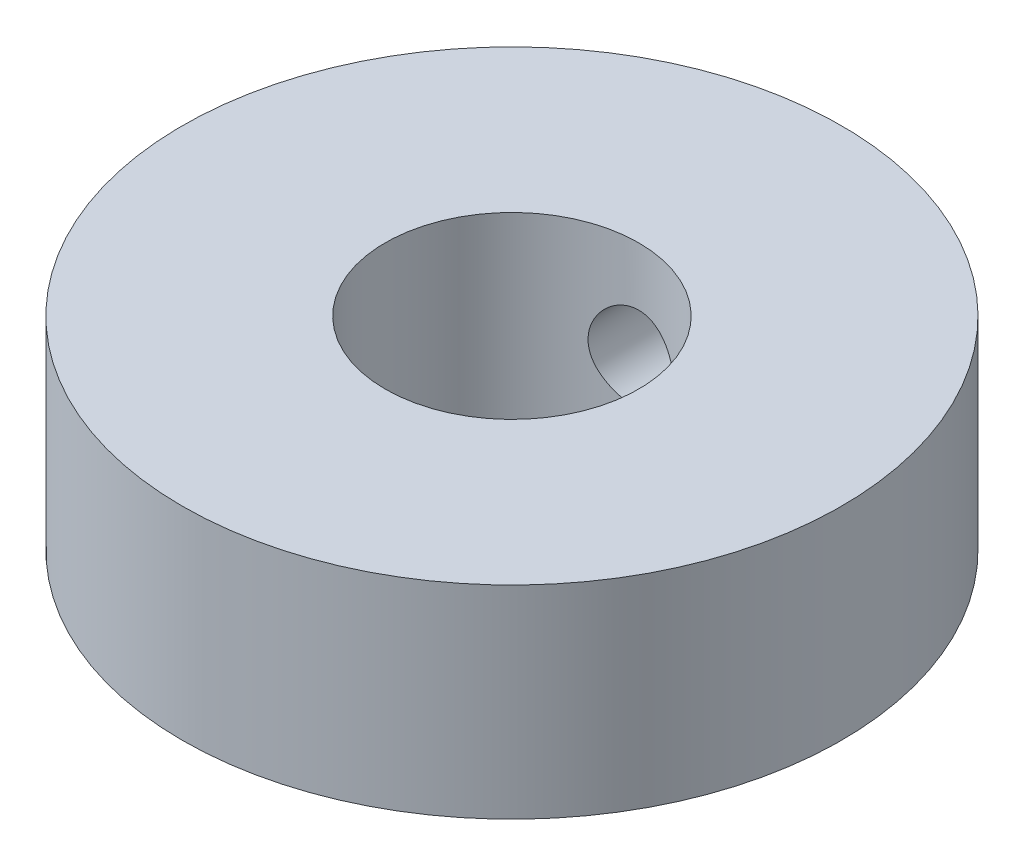
ISO-10303-21;
HEADER;
FILE_DESCRIPTION(('STEP AP214'),'2;1');
FILE_NAME('part.step','',(''),(''),'','','');
FILE_SCHEMA(('AUTOMOTIVE_DESIGN { 1 0 10303 214 1 1 1 1 }'));
ENDSEC;
DATA;
#1=APPLICATION_CONTEXT('core data for automotive mechanical design processes');
#2=APPLICATION_PROTOCOL_DEFINITION('international standard','automotive_design',2000,#1);
#3=PRODUCT_CONTEXT('',#1,'mechanical');
#4=PRODUCT('Part','Part','',(#3));
#5=PRODUCT_RELATED_PRODUCT_CATEGORY('part','',(#4));
#6=PRODUCT_DEFINITION_FORMATION('','',#4);
#7=PRODUCT_DEFINITION_CONTEXT('part definition',#1,'design');
#8=PRODUCT_DEFINITION('design','',#6,#7);
#9=PRODUCT_DEFINITION_SHAPE('','',#8);
#10=(LENGTH_UNIT() NAMED_UNIT(*) SI_UNIT(.MILLI.,.METRE.));
#11=(NAMED_UNIT(*) PLANE_ANGLE_UNIT() SI_UNIT($,.RADIAN.));
#12=(NAMED_UNIT(*) SI_UNIT($,.STERADIAN.) SOLID_ANGLE_UNIT());
#13=UNCERTAINTY_MEASURE_WITH_UNIT(LENGTH_MEASURE(1.E-05),#10,'distance_accuracy_value','');
#14=(GEOMETRIC_REPRESENTATION_CONTEXT(3) GLOBAL_UNCERTAINTY_ASSIGNED_CONTEXT((#13)) GLOBAL_UNIT_ASSIGNED_CONTEXT((#10,
#11,#12)) REPRESENTATION_CONTEXT('',''));
#15=CARTESIAN_POINT('',(0.,0.,0.));
#16=DIRECTION('',(0.,0.,1.));
#17=DIRECTION('',(1.,0.,0.));
#18=AXIS2_PLACEMENT_3D('',#15,#16,#17);
#19=CARTESIAN_POINT('',(0.,4.,0.));
#20=DIRECTION('',(0.,-1.,0.));
#21=DIRECTION('',(0.,0.,-1.));
#22=AXIS2_PLACEMENT_3D('',#19,#20,#21);
#23=CYLINDRICAL_SURFACE('',#22,6.5);
#24=CARTESIAN_POINT('',(0.,2.85,-6.5));
#25=CARTESIAN_POINT('',(-0.0475273119300373,2.84999799248828,-6.49999931236995));
#26=CARTESIAN_POINT('',(-0.0950838685352852,2.84600035816591,-6.49947323178086));
#27=CARTESIAN_POINT('',(-0.188872368165704,2.83011684021345,-6.49742520084858));
#28=CARTESIAN_POINT('',(-0.235102897000391,2.81822283933022,-6.49590222574721));
#29=CARTESIAN_POINT('',(-0.324868083813184,2.7869041035556,-6.49203188637918));
#30=CARTESIAN_POINT('',(-0.368404580616325,2.76748457249615,-6.48968509188108));
#31=CARTESIAN_POINT('',(-0.451592799552969,2.7216777075832,-6.48442776009261));
#32=CARTESIAN_POINT('',(-0.491245159131509,2.69529151969785,-6.48151731553985));
#33=CARTESIAN_POINT('',(-0.565785461247439,2.63613115202925,-6.47543781799477));
#34=CARTESIAN_POINT('',(-0.600646721904666,2.60332348431148,-6.47226746224012));
#35=CARTESIAN_POINT('',(-0.664385356510938,2.53232339768736,-6.46603589805202));
#36=CARTESIAN_POINT('',(-0.693262417465414,2.49413069730044,-6.46297469533459));
#37=CARTESIAN_POINT('',(-0.74431334689203,2.41326995922278,-6.4572952689164));
#38=CARTESIAN_POINT('',(-0.766462032006156,2.37058589399584,-6.45467872521815));
#39=CARTESIAN_POINT('',(-0.803266641578355,2.28206400552667,-6.45020220775352));
#40=CARTESIAN_POINT('',(-0.817922876539048,2.23622631306661,-6.44834220263528));
#41=CARTESIAN_POINT('',(-0.839245060342877,2.14297614512216,-6.44560189600989));
#42=CARTESIAN_POINT('',(-0.845956211853722,2.09557417116493,-6.44471605417937));
#43=CARTESIAN_POINT('',(-0.851337631414068,2.0003091413657,-6.44400745184395));
#44=CARTESIAN_POINT('',(-0.850008252370653,1.95244610585223,-6.44418464468138));
#45=CARTESIAN_POINT('',(-0.839383416745476,1.85793354974842,-6.44557702109154));
#46=CARTESIAN_POINT('',(-0.830137870368509,1.811278308926,-6.44678570114109));
#47=CARTESIAN_POINT('',(-0.804021074584761,1.72018722848242,-6.45009471801948));
#48=CARTESIAN_POINT('',(-0.787149657380237,1.67575143772138,-6.45219507446846));
#49=CARTESIAN_POINT('',(-0.746206767010475,1.59020626326385,-6.45705812107574));
#50=CARTESIAN_POINT('',(-0.72211372333688,1.54910732056856,-6.4598227905148));
#51=CARTESIAN_POINT('',(-0.667426908644924,1.47151694351829,-6.46570144773469));
#52=CARTESIAN_POINT('',(-0.636832812381057,1.43502573983264,-6.46881545298899));
#53=CARTESIAN_POINT('',(-0.569736309200595,1.36739708857793,-6.47507078642568));
#54=CARTESIAN_POINT('',(-0.533190905197018,1.33630228649931,-6.4782121429061));
#55=CARTESIAN_POINT('',(-0.455376896527025,1.28068155257026,-6.48414619584979));
#56=CARTESIAN_POINT('',(-0.414108279143427,1.25615563840706,-6.48693889137425));
#57=CARTESIAN_POINT('',(-0.327985545021085,1.21436838716425,-6.49186293139433));
#58=CARTESIAN_POINT('',(-0.283130052588049,1.1971098534394,-6.49399402059558));
#59=CARTESIAN_POINT('',(-0.191123614887421,1.1703818130707,-6.49735246309834));
#60=CARTESIAN_POINT('',(-0.143972787431609,1.16091190710848,-6.49857986273115));
#61=CARTESIAN_POINT('',(-0.0490827058108788,1.15008551807086,-6.49998658524286));
#62=CARTESIAN_POINT('',(-0.00135025940025587,1.14867031433475,-6.5001734933284));
#63=CARTESIAN_POINT('',(0.0936711479515367,1.15383834443808,-6.4994986892131));
#64=CARTESIAN_POINT('',(0.140960119225019,1.16042139146127,-6.49863700150447));
#65=CARTESIAN_POINT('',(0.233577960306399,1.18135026023174,-6.49596654168531));
#66=CARTESIAN_POINT('',(0.278913294107725,1.19566795181326,-6.49416120231276));
#67=CARTESIAN_POINT('',(0.366539538975663,1.2316303472019,-6.48980547358616));
#68=CARTESIAN_POINT('',(0.408830337795954,1.25327532098464,-6.48725505678));
#69=CARTESIAN_POINT('',(0.489428417687729,1.30341900138495,-6.48167440114856));
#70=CARTESIAN_POINT('',(0.527711980882102,1.3319555345954,-6.4786415468053));
#71=CARTESIAN_POINT('',(0.598967234536641,1.39501895679937,-6.47244311614296));
#72=CARTESIAN_POINT('',(0.631938693293378,1.42954610695535,-6.46927753404213));
#73=CARTESIAN_POINT('',(0.691843291628349,1.50386993358234,-6.46314688382088));
#74=CARTESIAN_POINT('',(0.718737409777831,1.5436981913656,-6.46018319234455));
#75=CARTESIAN_POINT('',(0.765453971337151,1.62734104705949,-6.45481490857007));
#76=CARTESIAN_POINT('',(0.78527656764822,1.67115555875319,-6.45241030418368));
#77=CARTESIAN_POINT('',(0.817224795407047,1.76140334255998,-6.44844196894699));
#78=CARTESIAN_POINT('',(0.829372110969365,1.80782882981979,-6.4468758710884));
#79=CARTESIAN_POINT('',(0.845694628529959,1.90208253157206,-6.44475519030191));
#80=CARTESIAN_POINT('',(0.84987023940484,1.94991067399319,-6.44420055549513));
#81=CARTESIAN_POINT('',(0.850122835656126,2.04522367056629,-6.44416720570299));
#82=CARTESIAN_POINT('',(0.846261133097074,2.0927083709792,-6.44468034527192));
#83=CARTESIAN_POINT('',(0.830678891126429,2.18634745705122,-6.44670717349693));
#84=CARTESIAN_POINT('',(0.818958353426524,2.23250184300008,-6.44822086193507));
#85=CARTESIAN_POINT('',(0.788010869452964,2.32216014144768,-6.45207564311973));
#86=CARTESIAN_POINT('',(0.768787167111572,2.36566518998194,-6.45441637825794));
#87=CARTESIAN_POINT('',(0.723385069356216,2.44884203326501,-6.45966206427547));
#88=CARTESIAN_POINT('',(0.697206554418634,2.48851376211941,-6.46256702485119));
#89=CARTESIAN_POINT('',(0.638411428341679,2.56321088075938,-6.46864036714318));
#90=CARTESIAN_POINT('',(0.605749169236973,2.59820019940238,-6.47181051866752));
#91=CARTESIAN_POINT('',(0.535009414588285,2.66222427410943,-6.4780415983337));
#92=CARTESIAN_POINT('',(0.496930648538757,2.69125762921894,-6.48110250063853));
#93=CARTESIAN_POINT('',(0.416255998760747,2.74264968738202,-6.48678438059768));
#94=CARTESIAN_POINT('',(0.373642000074418,2.76498014988817,-6.48940347710873));
#95=CARTESIAN_POINT('',(0.285257499923472,2.80213549893326,-6.49388776458797));
#96=CARTESIAN_POINT('',(0.239490454569184,2.81696845943889,-6.49575376611631));
#97=CARTESIAN_POINT('',(0.161244230967052,2.83519674337797,-6.49807688480155));
#98=CARTESIAN_POINT('',(0.129256406178424,2.84073987964473,-6.49879449916708));
#99=CARTESIAN_POINT('',(0.0648502577853982,2.84814217751771,-6.49975628940328));
#100=CARTESIAN_POINT('',(0.0324319377792675,2.85000136989644,-6.50000046922862));
#101=CARTESIAN_POINT('',(0.,2.85,-6.5));
#102=B_SPLINE_CURVE_WITH_KNOTS('',3,(#24,#25,#26,#27,#28,#29,#30,#31,#32,#33,#34,#35,#36,#37,
#38,#39,#40,#41,#42,#43,#44,#45,#46,#47,#48,#49,#50,#51,#52,#53,#54,#55,#56,#57,#58,#59,#60,#61,
#62,#63,#64,#65,#66,#67,#68,#69,#70,#71,#72,#73,#74,#75,#76,#77,#78,#79,#80,#81,#82,#83,#84,#85,
#86,#87,#88,#89,#90,#91,#92,#93,#94,#95,#96,#97,#98,#99,#100,#101),.UNSPECIFIED.,.T.,.F.,(4,2,2,
2,2,2,2,2,2,2,2,2,2,2,2,2,2,2,2,2,2,2,2,2,2,2,2,2,2,2,2,2,2,2,2,2,2,2,4),(0.,0.142463462525733,
0.285073600902839,0.427585301196982,0.57007357386517,0.713325732172383,0.856585381178341,
1.000374805454,1.14415827031556,1.28711970254374,1.43007486009443,1.57213528912614,
1.71419884417195,1.856691035145,1.99919035663422,2.14276903568952,2.28634810133738,
2.4299825012501,2.57360953665222,2.71618814287226,2.85876341892822,3.0008236193046,
3.14288905449594,3.28575273104674,3.42862263734086,3.57238534735202,3.71614494872143,
3.85949656443053,4.00284082729618,4.14509560786373,4.28735035744755,4.42954367235129,
4.57173943111083,4.71497427359935,4.85824276908101,5.00210667226394,5.14581531835642,
5.24303109934419,5.34024606827101),.UNSPECIFIED.);
#103=CARTESIAN_POINT('',(0.,2.85,-6.5));
#104=VERTEX_POINT('',#103);
#105=EDGE_CURVE('E58',#104,#104,#102,.T.);
#106=ORIENTED_EDGE('',*,*,#105,.T.);
#107=EDGE_LOOP('',(#106));
#108=FACE_BOUND('',#107,.T.);
#109=CARTESIAN_POINT('',(0.,4.,0.));
#110=DIRECTION('',(0.,1.,0.));
#111=DIRECTION('',(0.,0.,1.));
#112=AXIS2_PLACEMENT_3D('',#109,#110,#111);
#113=CIRCLE('',#112,6.5);
#114=CARTESIAN_POINT('',(0.,4.,6.5));
#115=VERTEX_POINT('',#114);
#116=EDGE_CURVE('E10',#115,#115,#113,.T.);
#117=ORIENTED_EDGE('',*,*,#116,.F.);
#118=EDGE_LOOP('',(#117));
#119=FACE_BOUND('',#118,.T.);
#120=CARTESIAN_POINT('',(0.,0.,0.));
#121=DIRECTION('',(0.,1.,0.));
#122=DIRECTION('',(0.,0.,1.));
#123=AXIS2_PLACEMENT_3D('',#120,#121,#122);
#124=CIRCLE('',#123,6.5);
#125=CARTESIAN_POINT('',(0.,0.,6.5));
#126=VERTEX_POINT('',#125);
#127=EDGE_CURVE('E48',#126,#126,#124,.T.);
#128=ORIENTED_EDGE('',*,*,#127,.T.);
#129=EDGE_LOOP('',(#128));
#130=FACE_BOUND('',#129,.T.);
#131=ADVANCED_FACE('F35',(#108,#119,#130),#23,.T.);
#132=CARTESIAN_POINT('',(0.,4.,0.));
#133=DIRECTION('',(0.,1.,0.));
#134=DIRECTION('',(0.,0.,1.));
#135=AXIS2_PLACEMENT_3D('',#132,#133,#134);
#136=PLANE('',#135);
#137=CARTESIAN_POINT('',(0.,4.,0.));
#138=DIRECTION('',(0.,1.,0.));
#139=DIRECTION('',(0.,0.,1.));
#140=AXIS2_PLACEMENT_3D('',#137,#138,#139);
#141=CIRCLE('',#140,2.5);
#142=CARTESIAN_POINT('',(0.,4.,2.5));
#143=VERTEX_POINT('',#142);
#144=EDGE_CURVE('E55',#143,#143,#141,.T.);
#145=ORIENTED_EDGE('',*,*,#144,.F.);
#146=EDGE_LOOP('',(#145));
#147=FACE_BOUND('',#146,.T.);
#148=ORIENTED_EDGE('',*,*,#116,.T.);
#149=EDGE_LOOP('',(#148));
#150=FACE_BOUND('',#149,.T.);
#151=ADVANCED_FACE('F76',(#147,#150),#136,.T.);
#152=CARTESIAN_POINT('',(0.,0.,0.));
#153=DIRECTION('',(0.,1.,0.));
#154=DIRECTION('',(0.,0.,1.));
#155=AXIS2_PLACEMENT_3D('',#152,#153,#154);
#156=PLANE('',#155);
#157=CARTESIAN_POINT('',(0.,0.,0.));
#158=DIRECTION('',(0.,1.,0.));
#159=DIRECTION('',(0.,0.,1.));
#160=AXIS2_PLACEMENT_3D('',#157,#158,#159);
#161=CIRCLE('',#160,2.5);
#162=CARTESIAN_POINT('',(0.,0.,2.5));
#163=VERTEX_POINT('',#162);
#164=EDGE_CURVE('E53',#163,#163,#161,.T.);
#165=ORIENTED_EDGE('',*,*,#164,.T.);
#166=EDGE_LOOP('',(#165));
#167=FACE_BOUND('',#166,.T.);
#168=ORIENTED_EDGE('',*,*,#127,.F.);
#169=EDGE_LOOP('',(#168));
#170=FACE_BOUND('',#169,.T.);
#171=ADVANCED_FACE('F74',(#167,#170),#156,.F.);
#172=CARTESIAN_POINT('',(0.,0.,0.));
#173=DIRECTION('',(0.,1.,0.));
#174=DIRECTION('',(0.,0.,1.));
#175=AXIS2_PLACEMENT_3D('',#172,#173,#174);
#176=CYLINDRICAL_SURFACE('',#175,2.5);
#177=CARTESIAN_POINT('',(0.85,2.,-2.35106358910175));
#178=CARTESIAN_POINT('',(0.850000417270898,1.95376164490342,-2.3510632609211));
#179=CARTESIAN_POINT('',(0.846214354628692,1.90752612226471,-2.35244254128552));
#180=CARTESIAN_POINT('',(0.831223875310693,1.81642861890939,-2.35778048931454));
#181=CARTESIAN_POINT('',(0.820018482005375,1.77156681983379,-2.3617394965555));
#182=CARTESIAN_POINT('',(0.790631455227936,1.68455195770899,-2.37173774436268));
#183=CARTESIAN_POINT('',(0.772463944485031,1.64239361146623,-2.37777277118094));
#184=CARTESIAN_POINT('',(0.729716931435302,1.56170902291919,-2.39123683414157));
#185=CARTESIAN_POINT('',(0.7051359268366,1.52318363447845,-2.3986661967775));
#186=CARTESIAN_POINT('',(0.649187335973049,1.44928956772992,-2.41442111465153));
#187=CARTESIAN_POINT('',(0.617602382715345,1.41409032601702,-2.4227696522799));
#188=CARTESIAN_POINT('',(0.549005955744845,1.34937217564943,-2.43922839215936));
#189=CARTESIAN_POINT('',(0.51199357221197,1.31985422129211,-2.4473385541765));
#190=CARTESIAN_POINT('',(0.432346716431164,1.26656061277013,-2.4626739166969));
#191=CARTESIAN_POINT('',(0.389586453681494,1.24296350328226,-2.46986895296675));
#192=CARTESIAN_POINT('',(0.300416628138625,1.20336479777731,-2.48229176229121));
#193=CARTESIAN_POINT('',(0.254008095502596,1.18736106654415,-2.48752008828811));
#194=CARTESIAN_POINT('',(0.160636361785038,1.1639809630024,-2.49525754722281));
#195=CARTESIAN_POINT('',(0.113753604818566,1.15631411308221,-2.49785799375087));
#196=CARTESIAN_POINT('',(0.0192997362665524,1.14890070609165,-2.5003713737019));
#197=CARTESIAN_POINT('',(-0.0282711874729492,1.14915202693685,-2.50028502719045));
#198=CARTESIAN_POINT('',(-0.120691048885994,1.15738587557199,-2.49749585373529));
#199=CARTESIAN_POINT('',(-0.165571873225012,1.16505267278795,-2.49489988196776));
#200=CARTESIAN_POINT('',(-0.253367127735348,1.18737635345875,-2.4875182170927));
#201=CARTESIAN_POINT('',(-0.296281423107985,1.20203371530909,-2.48273237412343));
#202=CARTESIAN_POINT('',(-0.379603280671135,1.23810082600777,-2.47137503550215));
#203=CARTESIAN_POINT('',(-0.419969516814054,1.25959847736236,-2.464780457795));
#204=CARTESIAN_POINT('',(-0.496613318407138,1.30866275214614,-2.45048921005046));
#205=CARTESIAN_POINT('',(-0.532889710810776,1.33623111010991,-2.44279222525125));
#206=CARTESIAN_POINT('',(-0.602199984798618,1.39823490603076,-2.42666096452814));
#207=CARTESIAN_POINT('',(-0.634988837975162,1.43294005356478,-2.41820903956142));
#208=CARTESIAN_POINT('',(-0.694362465349822,1.50742552246526,-2.40183505911393));
#209=CARTESIAN_POINT('',(-0.720946201284473,1.54720669145079,-2.39391309246575));
#210=CARTESIAN_POINT('',(-0.767512946148537,1.63151998575289,-2.37939703570253));
#211=CARTESIAN_POINT('',(-0.78738829677466,1.67611569984484,-2.37282521063779));
#212=CARTESIAN_POINT('',(-0.819262679307919,1.768301144217,-2.36201086330706));
#213=CARTESIAN_POINT('',(-0.831265172844013,1.81588954853627,-2.35776731745071));
#214=CARTESIAN_POINT('',(-0.846545419453233,1.91032801924697,-2.35232309828418));
#215=CARTESIAN_POINT('',(-0.850204583078747,1.95710871205399,-2.35098952835552));
#216=CARTESIAN_POINT('',(-0.849777826537737,2.05062480904703,-2.35114400939308));
#217=CARTESIAN_POINT('',(-0.845693387012103,2.09736022018174,-2.35263152094523));
#218=CARTESIAN_POINT('',(-0.830238624465381,2.1876917760919,-2.35812767196496));
#219=CARTESIAN_POINT('',(-0.819137710085228,2.23134030837741,-2.36204299077373));
#220=CARTESIAN_POINT('',(-0.790290757874596,2.31614485750604,-2.37184970007307));
#221=CARTESIAN_POINT('',(-0.772543512350059,2.35730041977571,-2.37774144967739));
#222=CARTESIAN_POINT('',(-0.730249496019326,2.43744187613449,-2.39107533826993));
#223=CARTESIAN_POINT('',(-0.705499493021902,2.47631293148089,-2.39856184703898));
#224=CARTESIAN_POINT('',(-0.650130609476585,2.54948774405826,-2.41415744920299));
#225=CARTESIAN_POINT('',(-0.619509932091421,2.58379009748513,-2.42226673275395));
#226=CARTESIAN_POINT('',(-0.551437950288512,2.64864095894312,-2.43868829519525));
#227=CARTESIAN_POINT('',(-0.513720241123424,2.67891328881005,-2.4469902188749));
#228=CARTESIAN_POINT('',(-0.433535678255624,2.73271917867289,-2.46246048598768));
#229=CARTESIAN_POINT('',(-0.391068972178961,2.75625294806096,-2.46962886464116));
#230=CARTESIAN_POINT('',(-0.302781496249904,2.79570440703804,-2.48199426666518));
#231=CARTESIAN_POINT('',(-0.25698352053833,2.81166910253286,-2.48720341443676));
#232=CARTESIAN_POINT('',(-0.163139800479464,2.83560027333913,-2.49511496143032));
#233=CARTESIAN_POINT('',(-0.115094911238798,2.84356976586972,-2.4978183062596));
#234=CARTESIAN_POINT('',(-0.0206423660222182,2.85100419484362,-2.50033943421401));
#235=CARTESIAN_POINT('',(0.0257308842034147,2.85086488776278,-2.50029149751882));
#236=CARTESIAN_POINT('',(0.117762499350606,2.84306830128258,-2.49764904324345));
#237=CARTESIAN_POINT('',(0.163420925917163,2.83541167383101,-2.49505474649913));
#238=CARTESIAN_POINT('',(0.251947466873049,2.81306328182051,-2.48766234362469));
#239=CARTESIAN_POINT('',(0.294849924546215,2.79849393784937,-2.48290264380538));
#240=CARTESIAN_POINT('',(0.377616312732194,2.76284816435145,-2.47166990694782));
#241=CARTESIAN_POINT('',(0.417479685013672,2.74177054293191,-2.46519655611128));
#242=CARTESIAN_POINT('',(0.494682981094277,2.69278937734382,-2.45089553866509));
#243=CARTESIAN_POINT('',(0.531870218388386,2.66465760710109,-2.44302587496346));
#244=CARTESIAN_POINT('',(0.601124501166333,2.60275036439852,-2.42691488104269));
#245=CARTESIAN_POINT('',(0.633189873262793,2.56897305480514,-2.41867343047861));
#246=CARTESIAN_POINT('',(0.692635540334885,2.49507138548244,-2.4023418828275));
#247=CARTESIAN_POINT('',(0.719768459755059,2.45474290051136,-2.39427200195622));
#248=CARTESIAN_POINT('',(0.766856524472176,2.36984557674414,-2.37960966353037));
#249=CARTESIAN_POINT('',(0.786813181124136,2.32527763330125,-2.37301689499931));
#250=CARTESIAN_POINT('',(0.818351576893879,2.23458712108657,-2.36232324634653));
#251=CARTESIAN_POINT('',(0.830179352234136,2.18855899332708,-2.35814982172544));
#252=CARTESIAN_POINT('',(0.84600184677171,2.09501919612417,-2.35252068304506));
#253=CARTESIAN_POINT('',(0.849999571270458,2.04750810298326,-2.35106392629454));
#254=CARTESIAN_POINT('',(0.85,2.,-2.35106358910175));
#255=B_SPLINE_CURVE_WITH_KNOTS('',3,(#177,#178,#179,#180,#181,#182,#183,#184,#185,#186,#187,
#188,#189,#190,#191,#192,#193,#194,#195,#196,#197,#198,#199,#200,#201,#202,#203,#204,#205,#206,
#207,#208,#209,#210,#211,#212,#213,#214,#215,#216,#217,#218,#219,#220,#221,#222,#223,#224,#225,
#226,#227,#228,#229,#230,#231,#232,#233,#234,#235,#236,#237,#238,#239,#240,#241,#242,#243,#244,
#245,#246,#247,#248,#249,#250,#251,#252,#253,#254),.UNSPECIFIED.,.T.,.F.,(4,2,2,2,2,2,2,2,2,2,2,
2,2,2,2,2,2,2,2,2,2,2,2,2,2,2,2,2,2,2,2,2,2,2,2,2,2,2,4),(0.,0.138538984056897,
0.277096208056713,0.415373842432438,0.553683895979384,0.697109051379096,0.840558277208318,
0.987919383682008,1.13523902843182,1.2772426781261,1.41920827090317,1.55538388401548,
1.69156881756944,1.82957975127894,1.96763016903507,2.11242566332657,2.25724536800301,
2.40428948862785,2.55126891177448,2.6913816646316,2.8314676294749,2.96647680550794,
3.10151052575207,3.24095660806484,3.3804454389722,3.52696162251753,3.67347325276533,
3.81906268724024,3.96459715867575,4.10303495326362,4.24146074274357,4.3775217112102,
4.51360761198262,4.65484595580123,4.79613035025872,4.94323414483594,5.09030694048565,
5.23270499826894,5.37504839063278),.UNSPECIFIED.);
#256=CARTESIAN_POINT('',(0.85,2.,-2.35106358910175));
#257=VERTEX_POINT('',#256);
#258=EDGE_CURVE('E39',#257,#257,#255,.T.);
#259=ORIENTED_EDGE('',*,*,#258,.T.);
#260=EDGE_LOOP('',(#259));
#261=FACE_BOUND('',#260,.T.);
#262=ORIENTED_EDGE('',*,*,#164,.F.);
#263=EDGE_LOOP('',(#262));
#264=FACE_BOUND('',#263,.T.);
#265=ORIENTED_EDGE('',*,*,#144,.T.);
#266=EDGE_LOOP('',(#265));
#267=FACE_BOUND('',#266,.T.);
#268=ADVANCED_FACE('F68',(#261,#264,#267),#176,.F.);
#269=CARTESIAN_POINT('',(0.,2.,-6.5));
#270=DIRECTION('',(0.,0.,1.));
#271=DIRECTION('',(1.,0.,0.));
#272=AXIS2_PLACEMENT_3D('',#269,#270,#271);
#273=CYLINDRICAL_SURFACE('',#272,0.85);
#274=ORIENTED_EDGE('',*,*,#258,.F.);
#275=EDGE_LOOP('',(#274));
#276=FACE_BOUND('',#275,.T.);
#277=ORIENTED_EDGE('',*,*,#105,.F.);
#278=EDGE_LOOP('',(#277));
#279=FACE_BOUND('',#278,.T.);
#280=ADVANCED_FACE('F65',(#276,#279),#273,.F.);
#281=CLOSED_SHELL('',(#131,#151,#171,#268,#280));
#282=MANIFOLD_SOLID_BREP('B2',#281);
#283=ADVANCED_BREP_SHAPE_REPRESENTATION('',(#18,#282),#14);
#284=SHAPE_DEFINITION_REPRESENTATION(#9,#283);
ENDSEC;
END-ISO-10303-21;
